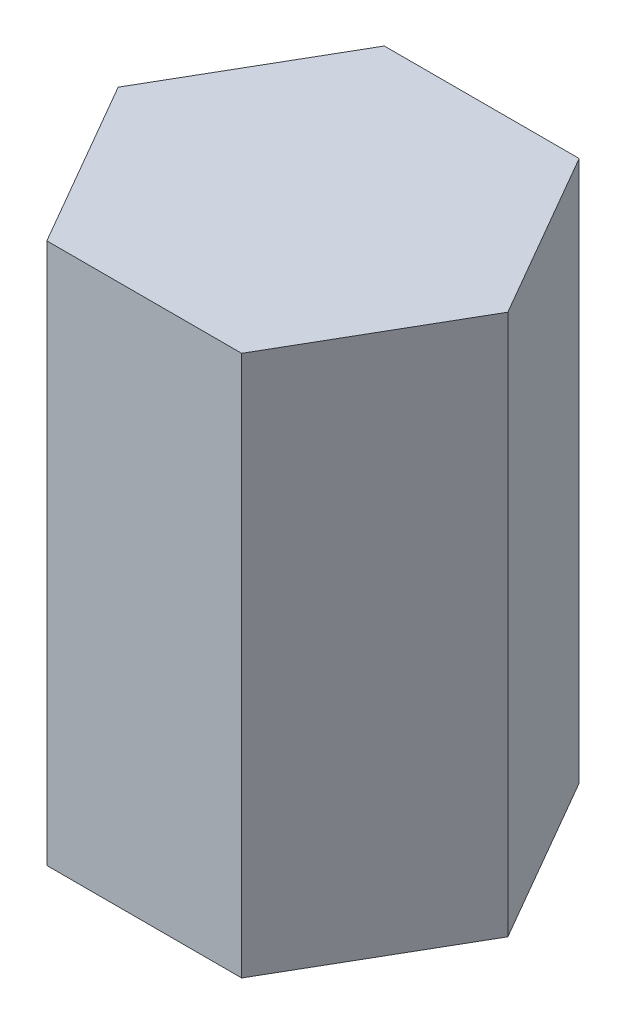
ISO-10303-21;
HEADER;
FILE_DESCRIPTION(('STEP AP214'),'2;1');
FILE_NAME('part.step','',(''),(''),'','','');
FILE_SCHEMA(('AUTOMOTIVE_DESIGN { 1 0 10303 214 1 1 1 1 }'));
ENDSEC;
DATA;
#1=APPLICATION_CONTEXT('core data for automotive mechanical design processes');
#2=APPLICATION_PROTOCOL_DEFINITION('international standard','automotive_design',2000,#1);
#3=PRODUCT_CONTEXT('',#1,'mechanical');
#4=PRODUCT('Part','Part','',(#3));
#5=PRODUCT_RELATED_PRODUCT_CATEGORY('part','',(#4));
#6=PRODUCT_DEFINITION_FORMATION('','',#4);
#7=PRODUCT_DEFINITION_CONTEXT('part definition',#1,'design');
#8=PRODUCT_DEFINITION('design','',#6,#7);
#9=PRODUCT_DEFINITION_SHAPE('','',#8);
#10=(LENGTH_UNIT() NAMED_UNIT(*) SI_UNIT(.MILLI.,.METRE.));
#11=(NAMED_UNIT(*) PLANE_ANGLE_UNIT() SI_UNIT($,.RADIAN.));
#12=(NAMED_UNIT(*) SI_UNIT($,.STERADIAN.) SOLID_ANGLE_UNIT());
#13=UNCERTAINTY_MEASURE_WITH_UNIT(LENGTH_MEASURE(1.E-05),#10,'distance_accuracy_value','');
#14=(GEOMETRIC_REPRESENTATION_CONTEXT(3) GLOBAL_UNCERTAINTY_ASSIGNED_CONTEXT((#13)) GLOBAL_UNIT_ASSIGNED_CONTEXT((#10,
#11,#12)) REPRESENTATION_CONTEXT('',''));
#15=CARTESIAN_POINT('',(0.,0.,0.));
#16=DIRECTION('',(0.,0.,1.));
#17=DIRECTION('',(1.,0.,0.));
#18=AXIS2_PLACEMENT_3D('',#15,#16,#17);
#19=CARTESIAN_POINT('',(288.675134594813,1603.,500.));
#20=DIRECTION('',(-0.866025403784439,0.,-0.5));
#21=DIRECTION('',(-0.5,0.,0.866025403784439));
#22=AXIS2_PLACEMENT_3D('',#19,#20,#21);
#23=PLANE('',#22);
#24=DIRECTION('',(0.5,0.,-0.866025403784439));
#25=VECTOR('',#24,1.);
#26=CARTESIAN_POINT('',(288.675134594813,0.,500.));
#27=LINE('',#26,#25);
#28=CARTESIAN_POINT('',(288.675134594813,0.,500.));
#29=VERTEX_POINT('',#28);
#30=CARTESIAN_POINT('',(577.350269189626,0.,0.));
#31=VERTEX_POINT('',#30);
#32=EDGE_CURVE('E132',#29,#31,#27,.T.);
#33=ORIENTED_EDGE('',*,*,#32,.T.);
#34=DIRECTION('',(0.,-1.,0.));
#35=VECTOR('',#34,1.);
#36=CARTESIAN_POINT('',(577.350269189626,1603.,0.));
#37=LINE('',#36,#35);
#38=CARTESIAN_POINT('',(577.350269189626,1603.,0.));
#39=VERTEX_POINT('',#38);
#40=EDGE_CURVE('E11',#39,#31,#37,.T.);
#41=ORIENTED_EDGE('',*,*,#40,.F.);
#42=DIRECTION('',(0.5,0.,-0.866025403784439));
#43=VECTOR('',#42,1.);
#44=CARTESIAN_POINT('',(288.675134594813,1603.,500.));
#45=LINE('',#44,#43);
#46=CARTESIAN_POINT('',(288.675134594813,1603.,500.));
#47=VERTEX_POINT('',#46);
#48=EDGE_CURVE('E143',#47,#39,#45,.T.);
#49=ORIENTED_EDGE('',*,*,#48,.F.);
#50=DIRECTION('',(0.,-1.,0.));
#51=VECTOR('',#50,1.);
#52=CARTESIAN_POINT('',(288.675134594813,1603.,500.));
#53=LINE('',#52,#51);
#54=EDGE_CURVE('E128',#47,#29,#53,.T.);
#55=ORIENTED_EDGE('',*,*,#54,.T.);
#56=EDGE_LOOP('',(#33,#41,#49,#55));
#57=FACE_BOUND('',#56,.T.);
#58=ADVANCED_FACE('F44',(#57),#23,.F.);
#59=CARTESIAN_POINT('',(577.350269189626,1603.,0.));
#60=DIRECTION('',(-0.866025403784439,0.,0.5));
#61=DIRECTION('',(0.5,0.,0.866025403784439));
#62=AXIS2_PLACEMENT_3D('',#59,#60,#61);
#63=PLANE('',#62);
#64=DIRECTION('',(-0.5,0.,-0.866025403784439));
#65=VECTOR('',#64,1.);
#66=CARTESIAN_POINT('',(577.350269189626,0.,0.));
#67=LINE('',#66,#65);
#68=CARTESIAN_POINT('',(288.675134594813,0.,-500.));
#69=VERTEX_POINT('',#68);
#70=EDGE_CURVE('E135',#31,#69,#67,.T.);
#71=ORIENTED_EDGE('',*,*,#70,.T.);
#72=DIRECTION('',(0.,-1.,0.));
#73=VECTOR('',#72,1.);
#74=CARTESIAN_POINT('',(288.675134594813,1603.,-500.));
#75=LINE('',#74,#73);
#76=CARTESIAN_POINT('',(288.675134594813,1603.,-500.));
#77=VERTEX_POINT('',#76);
#78=EDGE_CURVE('E52',#77,#69,#75,.T.);
#79=ORIENTED_EDGE('',*,*,#78,.F.);
#80=DIRECTION('',(-0.5,0.,-0.866025403784439));
#81=VECTOR('',#80,1.);
#82=CARTESIAN_POINT('',(577.350269189626,1603.,0.));
#83=LINE('',#82,#81);
#84=EDGE_CURVE('E98',#39,#77,#83,.T.);
#85=ORIENTED_EDGE('',*,*,#84,.F.);
#86=ORIENTED_EDGE('',*,*,#40,.T.);
#87=EDGE_LOOP('',(#71,#79,#85,#86));
#88=FACE_BOUND('',#87,.T.);
#89=ADVANCED_FACE('F167',(#88),#63,.F.);
#90=CARTESIAN_POINT('',(288.675134594813,1603.,-500.));
#91=DIRECTION('',(0.,0.,1.));
#92=DIRECTION('',(1.,0.,0.));
#93=AXIS2_PLACEMENT_3D('',#90,#91,#92);
#94=PLANE('',#93);
#95=DIRECTION('',(-1.,0.,0.));
#96=VECTOR('',#95,1.);
#97=CARTESIAN_POINT('',(288.675134594813,0.,-500.));
#98=LINE('',#97,#96);
#99=CARTESIAN_POINT('',(-288.675134594813,0.,-500.));
#100=VERTEX_POINT('',#99);
#101=EDGE_CURVE('E138',#69,#100,#98,.T.);
#102=ORIENTED_EDGE('',*,*,#101,.T.);
#103=DIRECTION('',(0.,-1.,0.));
#104=VECTOR('',#103,1.);
#105=CARTESIAN_POINT('',(-288.675134594813,1603.,-500.));
#106=LINE('',#105,#104);
#107=CARTESIAN_POINT('',(-288.675134594813,1603.,-500.));
#108=VERTEX_POINT('',#107);
#109=EDGE_CURVE('E123',#108,#100,#106,.T.);
#110=ORIENTED_EDGE('',*,*,#109,.F.);
#111=DIRECTION('',(-1.,0.,0.));
#112=VECTOR('',#111,1.);
#113=CARTESIAN_POINT('',(288.675134594813,1603.,-500.));
#114=LINE('',#113,#112);
#115=EDGE_CURVE('E114',#77,#108,#114,.T.);
#116=ORIENTED_EDGE('',*,*,#115,.F.);
#117=ORIENTED_EDGE('',*,*,#78,.T.);
#118=EDGE_LOOP('',(#102,#110,#116,#117));
#119=FACE_BOUND('',#118,.T.);
#120=ADVANCED_FACE('F149',(#119),#94,.F.);
#121=CARTESIAN_POINT('',(-288.675134594813,1603.,-500.));
#122=DIRECTION('',(0.866025403784438,0.,0.5));
#123=DIRECTION('',(0.5,0.,-0.866025403784439));
#124=AXIS2_PLACEMENT_3D('',#121,#122,#123);
#125=PLANE('',#124);
#126=DIRECTION('',(-0.5,0.,0.866025403784439));
#127=VECTOR('',#126,1.);
#128=CARTESIAN_POINT('',(-288.675134594813,0.,-500.));
#129=LINE('',#128,#127);
#130=CARTESIAN_POINT('',(-577.350269189626,0.,-1.66533453693773E-13));
#131=VERTEX_POINT('',#130);
#132=EDGE_CURVE('E122',#100,#131,#129,.T.);
#133=ORIENTED_EDGE('',*,*,#132,.T.);
#134=DIRECTION('',(0.,-1.,0.));
#135=VECTOR('',#134,1.);
#136=CARTESIAN_POINT('',(-577.350269189626,1603.,-1.66533453693773E-13));
#137=LINE('',#136,#135);
#138=CARTESIAN_POINT('',(-577.350269189626,1603.,-1.66533453693773E-13));
#139=VERTEX_POINT('',#138);
#140=EDGE_CURVE('E119',#139,#131,#137,.T.);
#141=ORIENTED_EDGE('',*,*,#140,.F.);
#142=DIRECTION('',(-0.5,0.,0.866025403784439));
#143=VECTOR('',#142,1.);
#144=CARTESIAN_POINT('',(-288.675134594813,1603.,-500.));
#145=LINE('',#144,#143);
#146=EDGE_CURVE('E108',#108,#139,#145,.T.);
#147=ORIENTED_EDGE('',*,*,#146,.F.);
#148=ORIENTED_EDGE('',*,*,#109,.T.);
#149=EDGE_LOOP('',(#133,#141,#147,#148));
#150=FACE_BOUND('',#149,.T.);
#151=ADVANCED_FACE('F120',(#150),#125,.F.);
#152=CARTESIAN_POINT('',(-577.350269189626,1603.,-1.66533453693773E-13));
#153=DIRECTION('',(0.866025403784439,0.,-0.5));
#154=DIRECTION('',(-0.5,0.,-0.866025403784439));
#155=AXIS2_PLACEMENT_3D('',#152,#153,#154);
#156=PLANE('',#155);
#157=DIRECTION('',(0.5,0.,0.866025403784439));
#158=VECTOR('',#157,1.);
#159=CARTESIAN_POINT('',(-577.350269189626,0.,-1.66533453693773E-13));
#160=LINE('',#159,#158);
#161=CARTESIAN_POINT('',(-288.675134594813,0.,500.));
#162=VERTEX_POINT('',#161);
#163=EDGE_CURVE('E84',#131,#162,#160,.T.);
#164=ORIENTED_EDGE('',*,*,#163,.T.);
#165=DIRECTION('',(0.,-1.,0.));
#166=VECTOR('',#165,1.);
#167=CARTESIAN_POINT('',(-288.675134594813,1603.,500.));
#168=LINE('',#167,#166);
#169=CARTESIAN_POINT('',(-288.675134594813,1603.,500.));
#170=VERTEX_POINT('',#169);
#171=EDGE_CURVE('E124',#170,#162,#168,.T.);
#172=ORIENTED_EDGE('',*,*,#171,.F.);
#173=DIRECTION('',(0.5,0.,0.866025403784439));
#174=VECTOR('',#173,1.);
#175=CARTESIAN_POINT('',(-577.350269189626,1603.,-1.66533453693773E-13));
#176=LINE('',#175,#174);
#177=EDGE_CURVE('E112',#139,#170,#176,.T.);
#178=ORIENTED_EDGE('',*,*,#177,.F.);
#179=ORIENTED_EDGE('',*,*,#140,.T.);
#180=EDGE_LOOP('',(#164,#172,#178,#179));
#181=FACE_BOUND('',#180,.T.);
#182=ADVANCED_FACE('F126',(#181),#156,.F.);
#183=CARTESIAN_POINT('',(-288.675134594813,1603.,500.));
#184=DIRECTION('',(0.,0.,-1.));
#185=DIRECTION('',(-1.,0.,0.));
#186=AXIS2_PLACEMENT_3D('',#183,#184,#185);
#187=PLANE('',#186);
#188=DIRECTION('',(1.,0.,0.));
#189=VECTOR('',#188,1.);
#190=CARTESIAN_POINT('',(-288.675134594813,0.,500.));
#191=LINE('',#190,#189);
#192=EDGE_CURVE('E90',#162,#29,#191,.T.);
#193=ORIENTED_EDGE('',*,*,#192,.T.);
#194=ORIENTED_EDGE('',*,*,#54,.F.);
#195=DIRECTION('',(1.,0.,0.));
#196=VECTOR('',#195,1.);
#197=CARTESIAN_POINT('',(-288.675134594813,1603.,500.));
#198=LINE('',#197,#196);
#199=EDGE_CURVE('E60',#170,#47,#198,.T.);
#200=ORIENTED_EDGE('',*,*,#199,.F.);
#201=ORIENTED_EDGE('',*,*,#171,.T.);
#202=EDGE_LOOP('',(#193,#194,#200,#201));
#203=FACE_BOUND('',#202,.T.);
#204=ADVANCED_FACE('F156',(#203),#187,.F.);
#205=CARTESIAN_POINT('',(0.,1603.,0.));
#206=DIRECTION('',(0.,1.,0.));
#207=DIRECTION('',(0.,0.,1.));
#208=AXIS2_PLACEMENT_3D('',#205,#206,#207);
#209=PLANE('',#208);
#210=ORIENTED_EDGE('',*,*,#48,.T.);
#211=ORIENTED_EDGE('',*,*,#84,.T.);
#212=ORIENTED_EDGE('',*,*,#115,.T.);
#213=ORIENTED_EDGE('',*,*,#146,.T.);
#214=ORIENTED_EDGE('',*,*,#177,.T.);
#215=ORIENTED_EDGE('',*,*,#199,.T.);
#216=EDGE_LOOP('',(#210,#211,#212,#213,#214,#215));
#217=FACE_BOUND('',#216,.T.);
#218=ADVANCED_FACE('F110',(#217),#209,.T.);
#219=CARTESIAN_POINT('',(0.,0.,0.));
#220=DIRECTION('',(0.,1.,0.));
#221=DIRECTION('',(0.,0.,1.));
#222=AXIS2_PLACEMENT_3D('',#219,#220,#221);
#223=PLANE('',#222);
#224=ORIENTED_EDGE('',*,*,#32,.F.);
#225=ORIENTED_EDGE('',*,*,#192,.F.);
#226=ORIENTED_EDGE('',*,*,#163,.F.);
#227=ORIENTED_EDGE('',*,*,#132,.F.);
#228=ORIENTED_EDGE('',*,*,#101,.F.);
#229=ORIENTED_EDGE('',*,*,#70,.F.);
#230=EDGE_LOOP('',(#224,#225,#226,#227,#228,#229));
#231=FACE_BOUND('',#230,.T.);
#232=ADVANCED_FACE('F152',(#231),#223,.F.);
#233=CLOSED_SHELL('',(#58,#89,#120,#151,#182,#204,#218,#232));
#234=CARTESIAN_POINT('',(287.520434056434,1588.,498.));
#235=DIRECTION('',(-0.866025403784439,0.,-0.499999999999999));
#236=DIRECTION('',(-0.499999999999999,0.,0.866025403784439));
#237=AXIS2_PLACEMENT_3D('',#234,#235,#236);
#238=PLANE('',#237);
#239=DIRECTION('',(0.499999999999999,0.,-0.866025403784439));
#240=VECTOR('',#239,1.);
#241=CARTESIAN_POINT('',(287.520434056434,400.75,498.));
#242=LINE('',#241,#240);
#243=CARTESIAN_POINT('',(287.520434056434,400.75,498.));
#244=VERTEX_POINT('',#243);
#245=CARTESIAN_POINT('',(575.040868112867,400.75,-2.22044516620346E-13));
#246=VERTEX_POINT('',#245);
#247=EDGE_CURVE('E339',#244,#246,#242,.T.);
#248=ORIENTED_EDGE('',*,*,#247,.F.);
#249=DIRECTION('',(0.,-1.,0.));
#250=VECTOR('',#249,1.);
#251=CARTESIAN_POINT('',(287.520434056434,1588.,498.));
#252=LINE('',#251,#250);
#253=CARTESIAN_POINT('',(287.520434056434,1588.,498.));
#254=VERTEX_POINT('',#253);
#255=EDGE_CURVE('E367',#254,#244,#252,.T.);
#256=ORIENTED_EDGE('',*,*,#255,.F.);
#257=DIRECTION('',(0.499999999999999,0.,-0.866025403784439));
#258=VECTOR('',#257,1.);
#259=CARTESIAN_POINT('',(287.520434056434,1588.,498.));
#260=LINE('',#259,#258);
#261=CARTESIAN_POINT('',(575.040868112867,1588.,-2.22044516620346E-13));
#262=VERTEX_POINT('',#261);
#263=EDGE_CURVE('E366',#254,#262,#260,.T.);
#264=ORIENTED_EDGE('',*,*,#263,.T.);
#265=DIRECTION('',(0.,-1.,0.));
#266=VECTOR('',#265,1.);
#267=CARTESIAN_POINT('',(575.040868112867,1588.,-2.22044516620346E-13));
#268=LINE('',#267,#266);
#269=EDGE_CURVE('E136',#262,#246,#268,.T.);
#270=ORIENTED_EDGE('',*,*,#269,.T.);
#271=EDGE_LOOP('',(#248,#256,#264,#270));
#272=FACE_BOUND('',#271,.T.);
#273=ADVANCED_FACE('F213',(#272),#238,.T.);
#274=CARTESIAN_POINT('',(575.040868112867,1588.,-2.22044516620346E-13));
#275=DIRECTION('',(-0.866025403784439,0.,0.5));
#276=DIRECTION('',(0.5,0.,0.866025403784439));
#277=AXIS2_PLACEMENT_3D('',#274,#275,#276);
#278=PLANE('',#277);
#279=DIRECTION('',(-0.5,0.,-0.866025403784439));
#280=VECTOR('',#279,1.);
#281=CARTESIAN_POINT('',(575.040868112867,400.75,-2.22044516620346E-13));
#282=LINE('',#281,#280);
#283=CARTESIAN_POINT('',(287.520434056434,400.75,-498.));
#284=VERTEX_POINT('',#283);
#285=EDGE_CURVE('E343',#246,#284,#282,.T.);
#286=ORIENTED_EDGE('',*,*,#285,.F.);
#287=ORIENTED_EDGE('',*,*,#269,.F.);
#288=DIRECTION('',(-0.5,0.,-0.866025403784439));
#289=VECTOR('',#288,1.);
#290=CARTESIAN_POINT('',(575.040868112867,1588.,-2.22044516620346E-13));
#291=LINE('',#290,#289);
#292=CARTESIAN_POINT('',(287.520434056434,1588.,-498.));
#293=VERTEX_POINT('',#292);
#294=EDGE_CURVE('E389',#262,#293,#291,.T.);
#295=ORIENTED_EDGE('',*,*,#294,.T.);
#296=DIRECTION('',(0.,-1.,0.));
#297=VECTOR('',#296,1.);
#298=CARTESIAN_POINT('',(287.520434056434,1588.,-498.));
#299=LINE('',#298,#297);
#300=EDGE_CURVE('E378',#293,#284,#299,.T.);
#301=ORIENTED_EDGE('',*,*,#300,.T.);
#302=EDGE_LOOP('',(#286,#287,#295,#301));
#303=FACE_BOUND('',#302,.T.);
#304=ADVANCED_FACE('F216',(#303),#278,.T.);
#305=CARTESIAN_POINT('',(287.520434056434,1588.,-498.));
#306=DIRECTION('',(0.,0.,1.));
#307=DIRECTION('',(1.,0.,0.));
#308=AXIS2_PLACEMENT_3D('',#305,#306,#307);
#309=PLANE('',#308);
#310=DIRECTION('',(-1.,0.,0.));
#311=VECTOR('',#310,1.);
#312=CARTESIAN_POINT('',(287.520434056434,400.75,-498.));
#313=LINE('',#312,#311);
#314=CARTESIAN_POINT('',(-287.520434056434,400.75,-498.));
#315=VERTEX_POINT('',#314);
#316=EDGE_CURVE('E353',#284,#315,#313,.T.);
#317=ORIENTED_EDGE('',*,*,#316,.F.);
#318=ORIENTED_EDGE('',*,*,#300,.F.);
#319=DIRECTION('',(-1.,0.,0.));
#320=VECTOR('',#319,1.);
#321=CARTESIAN_POINT('',(287.520434056434,1588.,-498.));
#322=LINE('',#321,#320);
#323=CARTESIAN_POINT('',(-287.520434056434,1588.,-498.));
#324=VERTEX_POINT('',#323);
#325=EDGE_CURVE('E419',#293,#324,#322,.T.);
#326=ORIENTED_EDGE('',*,*,#325,.T.);
#327=DIRECTION('',(0.,-1.,0.));
#328=VECTOR('',#327,1.);
#329=CARTESIAN_POINT('',(-287.520434056434,1588.,-498.));
#330=LINE('',#329,#328);
#331=EDGE_CURVE('E375',#324,#315,#330,.T.);
#332=ORIENTED_EDGE('',*,*,#331,.T.);
#333=EDGE_LOOP('',(#317,#318,#326,#332));
#334=FACE_BOUND('',#333,.T.);
#335=ADVANCED_FACE('F228',(#334),#309,.T.);
#336=CARTESIAN_POINT('',(-287.520434056434,1588.,-498.));
#337=DIRECTION('',(0.866025403784439,0.,0.5));
#338=DIRECTION('',(0.5,0.,-0.866025403784439));
#339=AXIS2_PLACEMENT_3D('',#336,#337,#338);
#340=PLANE('',#339);
#341=DIRECTION('',(-0.5,0.,0.866025403784439));
#342=VECTOR('',#341,1.);
#343=CARTESIAN_POINT('',(-287.520434056434,400.75,-498.));
#344=LINE('',#343,#342);
#345=CARTESIAN_POINT('',(-575.040868112867,400.75,1.11117472057605E-13));
#346=VERTEX_POINT('',#345);
#347=EDGE_CURVE('E360',#315,#346,#344,.T.);
#348=ORIENTED_EDGE('',*,*,#347,.F.);
#349=ORIENTED_EDGE('',*,*,#331,.F.);
#350=DIRECTION('',(-0.5,0.,0.866025403784439));
#351=VECTOR('',#350,1.);
#352=CARTESIAN_POINT('',(-287.520434056434,1588.,-498.));
#353=LINE('',#352,#351);
#354=CARTESIAN_POINT('',(-575.040868112867,1588.,1.11117472057605E-13));
#355=VERTEX_POINT('',#354);
#356=EDGE_CURVE('E423',#324,#355,#353,.T.);
#357=ORIENTED_EDGE('',*,*,#356,.T.);
#358=DIRECTION('',(0.,-1.,0.));
#359=VECTOR('',#358,1.);
#360=CARTESIAN_POINT('',(-575.040868112867,1588.,1.11117472057605E-13));
#361=LINE('',#360,#359);
#362=EDGE_CURVE('E372',#355,#346,#361,.T.);
#363=ORIENTED_EDGE('',*,*,#362,.T.);
#364=EDGE_LOOP('',(#348,#349,#357,#363));
#365=FACE_BOUND('',#364,.T.);
#366=ADVANCED_FACE('F239',(#365),#340,.T.);
#367=CARTESIAN_POINT('',(-575.040868112867,1588.,1.11117472057605E-13));
#368=DIRECTION('',(0.866025403784438,0.,-0.5));
#369=DIRECTION('',(-0.5,0.,-0.866025403784439));
#370=AXIS2_PLACEMENT_3D('',#367,#368,#369);
#371=PLANE('',#370);
#372=DIRECTION('',(0.5,0.,0.866025403784438));
#373=VECTOR('',#372,1.);
#374=CARTESIAN_POINT('',(-575.040868112867,400.75,1.11117472057605E-13));
#375=LINE('',#374,#373);
#376=CARTESIAN_POINT('',(-287.520434056434,400.75,498.));
#377=VERTEX_POINT('',#376);
#378=EDGE_CURVE('E363',#346,#377,#375,.T.);
#379=ORIENTED_EDGE('',*,*,#378,.F.);
#380=ORIENTED_EDGE('',*,*,#362,.F.);
#381=DIRECTION('',(0.5,0.,0.866025403784438));
#382=VECTOR('',#381,1.);
#383=CARTESIAN_POINT('',(-575.040868112867,1588.,1.11117472057605E-13));
#384=LINE('',#383,#382);
#385=CARTESIAN_POINT('',(-287.520434056434,1588.,498.));
#386=VERTEX_POINT('',#385);
#387=EDGE_CURVE('E416',#355,#386,#384,.T.);
#388=ORIENTED_EDGE('',*,*,#387,.T.);
#389=DIRECTION('',(0.,-1.,0.));
#390=VECTOR('',#389,1.);
#391=CARTESIAN_POINT('',(-287.520434056434,1588.,498.));
#392=LINE('',#391,#390);
#393=EDGE_CURVE('E369',#386,#377,#392,.T.);
#394=ORIENTED_EDGE('',*,*,#393,.T.);
#395=EDGE_LOOP('',(#379,#380,#388,#394));
#396=FACE_BOUND('',#395,.T.);
#397=ADVANCED_FACE('F250',(#396),#371,.T.);
#398=CARTESIAN_POINT('',(-287.520434056434,1588.,498.));
#399=DIRECTION('',(0.,0.,-1.));
#400=DIRECTION('',(-1.,0.,0.));
#401=AXIS2_PLACEMENT_3D('',#398,#399,#400);
#402=PLANE('',#401);
#403=DIRECTION('',(1.,0.,0.));
#404=VECTOR('',#403,1.);
#405=CARTESIAN_POINT('',(-287.520434056434,400.75,498.));
#406=LINE('',#405,#404);
#407=EDGE_CURVE('E347',#377,#244,#406,.T.);
#408=ORIENTED_EDGE('',*,*,#407,.F.);
#409=ORIENTED_EDGE('',*,*,#393,.F.);
#410=DIRECTION('',(1.,0.,0.));
#411=VECTOR('',#410,1.);
#412=CARTESIAN_POINT('',(-287.520434056434,1588.,498.));
#413=LINE('',#412,#411);
#414=EDGE_CURVE('E356',#386,#254,#413,.T.);
#415=ORIENTED_EDGE('',*,*,#414,.T.);
#416=ORIENTED_EDGE('',*,*,#255,.T.);
#417=EDGE_LOOP('',(#408,#409,#415,#416));
#418=FACE_BOUND('',#417,.T.);
#419=ADVANCED_FACE('F261',(#418),#402,.T.);
#420=CARTESIAN_POINT('',(0.,1588.,0.));
#421=DIRECTION('',(0.,1.,0.));
#422=DIRECTION('',(0.,0.,1.));
#423=AXIS2_PLACEMENT_3D('',#420,#421,#422);
#424=PLANE('',#423);
#425=ORIENTED_EDGE('',*,*,#263,.F.);
#426=ORIENTED_EDGE('',*,*,#414,.F.);
#427=ORIENTED_EDGE('',*,*,#387,.F.);
#428=ORIENTED_EDGE('',*,*,#356,.F.);
#429=ORIENTED_EDGE('',*,*,#325,.F.);
#430=ORIENTED_EDGE('',*,*,#294,.F.);
#431=EDGE_LOOP('',(#425,#426,#427,#428,#429,#430));
#432=FACE_BOUND('',#431,.T.);
#433=ADVANCED_FACE('F272',(#432),#424,.F.);
#434=CARTESIAN_POINT('',(0.,400.75,0.));
#435=DIRECTION('',(0.,1.,0.));
#436=DIRECTION('',(0.,0.,1.));
#437=AXIS2_PLACEMENT_3D('',#434,#435,#436);
#438=PLANE('',#437);
#439=ORIENTED_EDGE('',*,*,#247,.T.);
#440=ORIENTED_EDGE('',*,*,#285,.T.);
#441=ORIENTED_EDGE('',*,*,#316,.T.);
#442=ORIENTED_EDGE('',*,*,#347,.T.);
#443=ORIENTED_EDGE('',*,*,#378,.T.);
#444=ORIENTED_EDGE('',*,*,#407,.T.);
#445=EDGE_LOOP('',(#439,#440,#441,#442,#443,#444));
#446=FACE_BOUND('',#445,.T.);
#447=ADVANCED_FACE('F283',(#446),#438,.T.);
#448=CLOSED_SHELL('',(#273,#304,#335,#366,#397,#419,#433,#447));
#449=ORIENTED_CLOSED_SHELL('',*,#448,.T.);
#450=BREP_WITH_VOIDS('B2',#233,(#449));
#451=ADVANCED_BREP_SHAPE_REPRESENTATION('',(#18,#450),#14);
#452=SHAPE_DEFINITION_REPRESENTATION(#9,#451);
ENDSEC;
END-ISO-10303-21;
